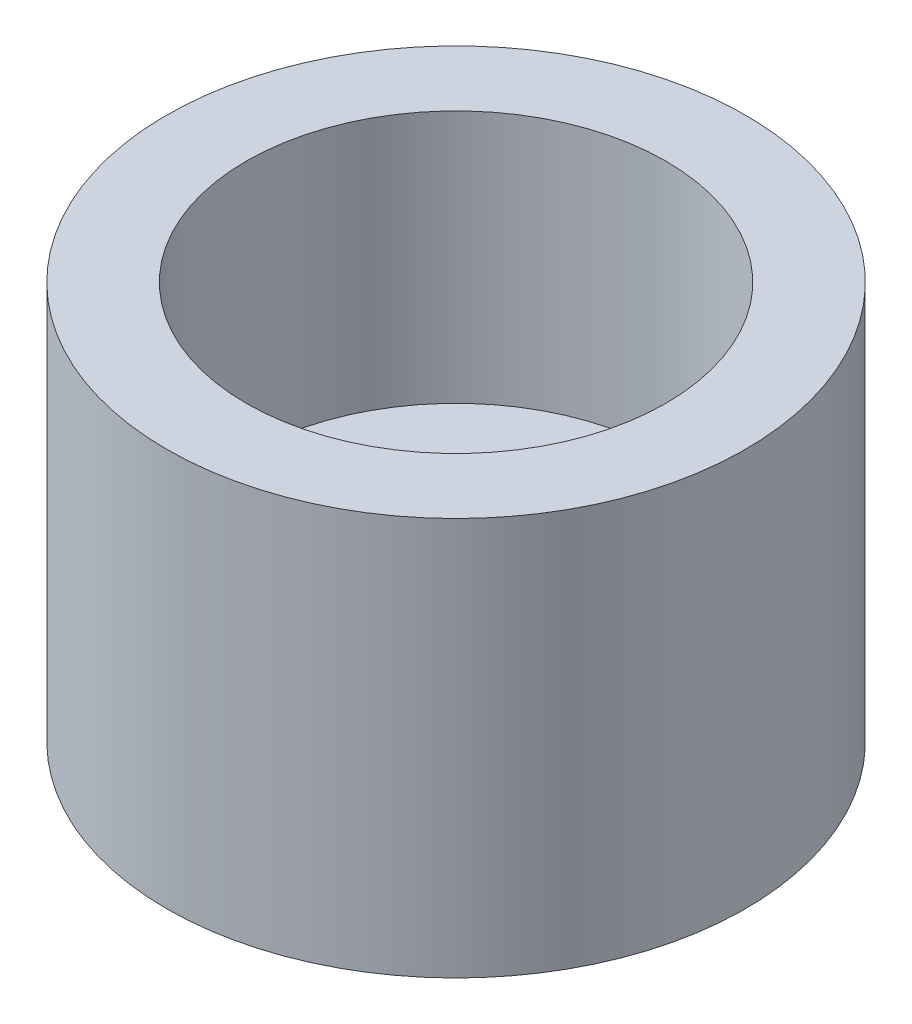
ISO-10303-21;
HEADER;
FILE_DESCRIPTION(('STEP AP214'),'2;1');
FILE_NAME('part.step','',(''),(''),'','','');
FILE_SCHEMA(('AUTOMOTIVE_DESIGN { 1 0 10303 214 1 1 1 1 }'));
ENDSEC;
DATA;
#1=APPLICATION_CONTEXT('core data for automotive mechanical design processes');
#2=APPLICATION_PROTOCOL_DEFINITION('international standard','automotive_design',2000,#1);
#3=PRODUCT_CONTEXT('',#1,'mechanical');
#4=PRODUCT('Part','Part','',(#3));
#5=PRODUCT_RELATED_PRODUCT_CATEGORY('part','',(#4));
#6=PRODUCT_DEFINITION_FORMATION('','',#4);
#7=PRODUCT_DEFINITION_CONTEXT('part definition',#1,'design');
#8=PRODUCT_DEFINITION('design','',#6,#7);
#9=PRODUCT_DEFINITION_SHAPE('','',#8);
#10=(LENGTH_UNIT() NAMED_UNIT(*) SI_UNIT(.MILLI.,.METRE.));
#11=(NAMED_UNIT(*) PLANE_ANGLE_UNIT() SI_UNIT($,.RADIAN.));
#12=(NAMED_UNIT(*) SI_UNIT($,.STERADIAN.) SOLID_ANGLE_UNIT());
#13=UNCERTAINTY_MEASURE_WITH_UNIT(LENGTH_MEASURE(1.E-05),#10,'distance_accuracy_value','');
#14=(GEOMETRIC_REPRESENTATION_CONTEXT(3) GLOBAL_UNCERTAINTY_ASSIGNED_CONTEXT((#13)) GLOBAL_UNIT_ASSIGNED_CONTEXT((#10,
#11,#12)) REPRESENTATION_CONTEXT('',''));
#15=CARTESIAN_POINT('',(0.,0.,0.));
#16=DIRECTION('',(0.,0.,1.));
#17=DIRECTION('',(1.,0.,0.));
#18=AXIS2_PLACEMENT_3D('',#15,#16,#17);
#19=CARTESIAN_POINT('',(0.,2.,0.));
#20=DIRECTION('',(0.,-1.,0.));
#21=DIRECTION('',(0.,0.,-1.));
#22=AXIS2_PLACEMENT_3D('',#19,#20,#21);
#23=CYLINDRICAL_SURFACE('',#22,4.);
#24=CARTESIAN_POINT('',(0.,0.,0.));
#25=DIRECTION('',(0.,1.,0.));
#26=DIRECTION('',(0.,0.,1.));
#27=AXIS2_PLACEMENT_3D('',#24,#25,#26);
#28=CIRCLE('',#27,4.);
#29=CARTESIAN_POINT('',(0.,0.,4.));
#30=VERTEX_POINT('',#29);
#31=EDGE_CURVE('E50',#30,#30,#28,.T.);
#32=ORIENTED_EDGE('',*,*,#31,.T.);
#33=EDGE_LOOP('',(#32));
#34=FACE_BOUND('',#33,.T.);
#35=CARTESIAN_POINT('',(0.,5.5,0.));
#36=DIRECTION('',(0.,1.,0.));
#37=DIRECTION('',(0.,0.,1.));
#38=AXIS2_PLACEMENT_3D('',#35,#36,#37);
#39=CIRCLE('',#38,4.);
#40=CARTESIAN_POINT('',(0.,5.5,4.));
#41=VERTEX_POINT('',#40);
#42=EDGE_CURVE('E55',#41,#41,#39,.T.);
#43=ORIENTED_EDGE('',*,*,#42,.F.);
#44=EDGE_LOOP('',(#43));
#45=FACE_BOUND('',#44,.T.);
#46=ADVANCED_FACE('F43',(#34,#45),#23,.T.);
#47=CARTESIAN_POINT('',(0.,0.,0.));
#48=DIRECTION('',(0.,1.,0.));
#49=DIRECTION('',(0.,0.,1.));
#50=AXIS2_PLACEMENT_3D('',#47,#48,#49);
#51=PLANE('',#50);
#52=ORIENTED_EDGE('',*,*,#31,.F.);
#53=EDGE_LOOP('',(#52));
#54=FACE_BOUND('',#53,.T.);
#55=ADVANCED_FACE('F71',(#54),#51,.F.);
#56=CARTESIAN_POINT('',(0.,5.5,0.));
#57=DIRECTION('',(0.,1.,0.));
#58=DIRECTION('',(0.,0.,1.));
#59=AXIS2_PLACEMENT_3D('',#56,#57,#58);
#60=PLANE('',#59);
#61=ORIENTED_EDGE('',*,*,#42,.T.);
#62=EDGE_LOOP('',(#61));
#63=FACE_BOUND('',#62,.T.);
#64=CARTESIAN_POINT('',(0.,5.5,0.));
#65=DIRECTION('',(0.,1.,0.));
#66=DIRECTION('',(0.,0.,1.));
#67=AXIS2_PLACEMENT_3D('',#64,#65,#66);
#68=CIRCLE('',#67,2.9);
#69=CARTESIAN_POINT('',(0.,5.5,2.9));
#70=VERTEX_POINT('',#69);
#71=EDGE_CURVE('E60',#70,#70,#68,.T.);
#72=ORIENTED_EDGE('',*,*,#71,.F.);
#73=EDGE_LOOP('',(#72));
#74=FACE_BOUND('',#73,.T.);
#75=ADVANCED_FACE('F69',(#63,#74),#60,.T.);
#76=CARTESIAN_POINT('',(0.,5.5,0.));
#77=DIRECTION('',(0.,-1.,0.));
#78=DIRECTION('',(0.,0.,-1.));
#79=AXIS2_PLACEMENT_3D('',#76,#77,#78);
#80=CYLINDRICAL_SURFACE('',#79,2.9);
#81=ORIENTED_EDGE('',*,*,#71,.T.);
#82=EDGE_LOOP('',(#81));
#83=FACE_BOUND('',#82,.T.);
#84=CARTESIAN_POINT('',(0.,2.,0.));
#85=DIRECTION('',(0.,1.,0.));
#86=DIRECTION('',(0.,0.,1.));
#87=AXIS2_PLACEMENT_3D('',#84,#85,#86);
#88=CIRCLE('',#87,2.9);
#89=CARTESIAN_POINT('',(0.,2.,2.9));
#90=VERTEX_POINT('',#89);
#91=EDGE_CURVE('E10',#90,#90,#88,.F.);
#92=ORIENTED_EDGE('',*,*,#91,.T.);
#93=EDGE_LOOP('',(#92));
#94=FACE_BOUND('',#93,.T.);
#95=ADVANCED_FACE('F67',(#83,#94),#80,.F.);
#96=CARTESIAN_POINT('',(0.,2.,0.));
#97=DIRECTION('',(0.,1.,0.));
#98=DIRECTION('',(0.,0.,1.));
#99=AXIS2_PLACEMENT_3D('',#96,#97,#98);
#100=PLANE('',#99);
#101=ORIENTED_EDGE('',*,*,#91,.F.);
#102=EDGE_LOOP('',(#101));
#103=FACE_BOUND('',#102,.T.);
#104=ADVANCED_FACE('F78',(#103),#100,.T.);
#105=CLOSED_SHELL('',(#46,#55,#75,#95,#104));
#106=MANIFOLD_SOLID_BREP('B2',#105);
#107=ADVANCED_BREP_SHAPE_REPRESENTATION('',(#18,#106),#14);
#108=SHAPE_DEFINITION_REPRESENTATION(#9,#107);
ENDSEC;
END-ISO-10303-21;
